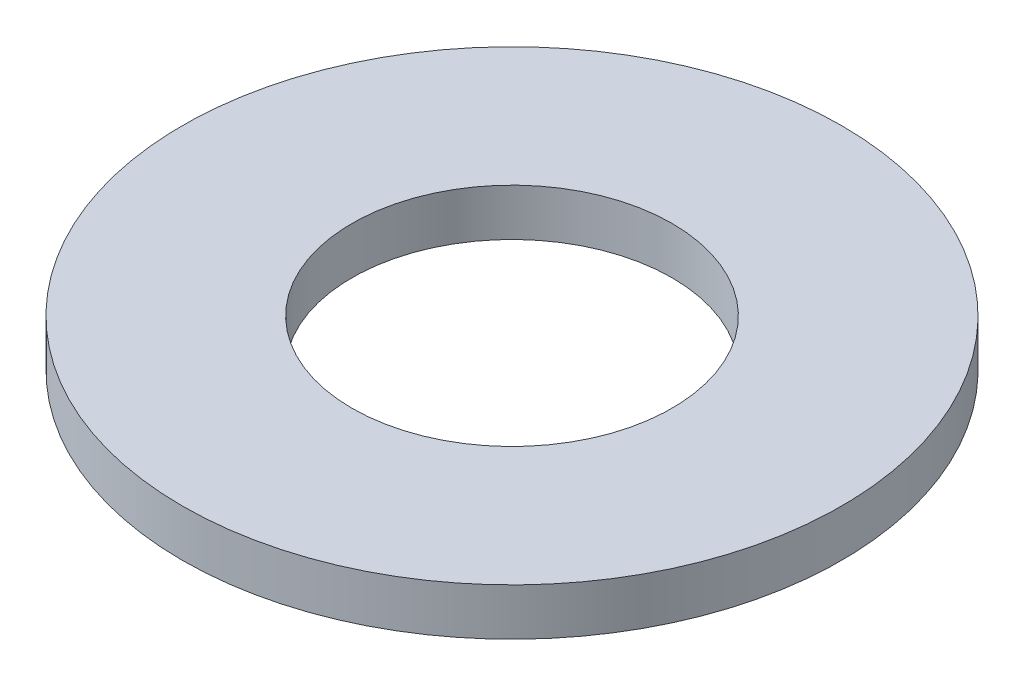
ISO-10303-21;
HEADER;
FILE_DESCRIPTION(('STEP AP214'),'2;1');
FILE_NAME('part.step','',(''),(''),'','','');
FILE_SCHEMA(('AUTOMOTIVE_DESIGN { 1 0 10303 214 1 1 1 1 }'));
ENDSEC;
DATA;
#1=APPLICATION_CONTEXT('core data for automotive mechanical design processes');
#2=APPLICATION_PROTOCOL_DEFINITION('international standard','automotive_design',2000,#1);
#3=PRODUCT_CONTEXT('',#1,'mechanical');
#4=PRODUCT('Part','Part','',(#3));
#5=PRODUCT_RELATED_PRODUCT_CATEGORY('part','',(#4));
#6=PRODUCT_DEFINITION_FORMATION('','',#4);
#7=PRODUCT_DEFINITION_CONTEXT('part definition',#1,'design');
#8=PRODUCT_DEFINITION('design','',#6,#7);
#9=PRODUCT_DEFINITION_SHAPE('','',#8);
#10=(LENGTH_UNIT() NAMED_UNIT(*) SI_UNIT(.MILLI.,.METRE.));
#11=(NAMED_UNIT(*) PLANE_ANGLE_UNIT() SI_UNIT($,.RADIAN.));
#12=(NAMED_UNIT(*) SI_UNIT($,.STERADIAN.) SOLID_ANGLE_UNIT());
#13=UNCERTAINTY_MEASURE_WITH_UNIT(LENGTH_MEASURE(1.E-05),#10,'distance_accuracy_value','');
#14=(GEOMETRIC_REPRESENTATION_CONTEXT(3) GLOBAL_UNCERTAINTY_ASSIGNED_CONTEXT((#13)) GLOBAL_UNIT_ASSIGNED_CONTEXT((#10,
#11,#12)) REPRESENTATION_CONTEXT('',''));
#15=CARTESIAN_POINT('',(0.,0.,0.));
#16=DIRECTION('',(0.,0.,1.));
#17=DIRECTION('',(1.,0.,0.));
#18=AXIS2_PLACEMENT_3D('',#15,#16,#17);
#19=CARTESIAN_POINT('',(0.,0.,0.));
#20=DIRECTION('',(0.,-1.,0.));
#21=DIRECTION('',(0.,0.,-1.));
#22=AXIS2_PLACEMENT_3D('',#19,#20,#21);
#23=CYLINDRICAL_SURFACE('',#22,1.7);
#24=CARTESIAN_POINT('',(0.,9.14450704225353,0.));
#25=DIRECTION('',(0.,-1.,0.));
#26=DIRECTION('',(0.,0.,-1.));
#27=AXIS2_PLACEMENT_3D('',#24,#25,#26);
#28=CIRCLE('',#27,1.7);
#29=CARTESIAN_POINT('',(0.,9.14450704225353,-1.7));
#30=VERTEX_POINT('',#29);
#31=EDGE_CURVE('E10',#30,#30,#28,.T.);
#32=ORIENTED_EDGE('',*,*,#31,.F.);
#33=EDGE_LOOP('',(#32));
#34=FACE_BOUND('',#33,.T.);
#35=CARTESIAN_POINT('',(0.,8.64450704225353,0.));
#36=DIRECTION('',(0.,-1.,0.));
#37=DIRECTION('',(0.,0.,-1.));
#38=AXIS2_PLACEMENT_3D('',#35,#36,#37);
#39=CIRCLE('',#38,1.7);
#40=CARTESIAN_POINT('',(0.,8.64450704225353,-1.7));
#41=VERTEX_POINT('',#40);
#42=EDGE_CURVE('E52',#41,#41,#39,.T.);
#43=ORIENTED_EDGE('',*,*,#42,.T.);
#44=EDGE_LOOP('',(#43));
#45=FACE_BOUND('',#44,.T.);
#46=ADVANCED_FACE('F34',(#34,#45),#23,.F.);
#47=CARTESIAN_POINT('',(-1.7,9.14450704225353,0.));
#48=DIRECTION('',(0.,-1.,0.));
#49=DIRECTION('',(0.,0.,-1.));
#50=AXIS2_PLACEMENT_3D('',#47,#48,#49);
#51=PLANE('',#50);
#52=CARTESIAN_POINT('',(0.,9.14450704225353,0.));
#53=DIRECTION('',(0.,-1.,0.));
#54=DIRECTION('',(0.,0.,-1.));
#55=AXIS2_PLACEMENT_3D('',#52,#53,#54);
#56=CIRCLE('',#55,3.5);
#57=CARTESIAN_POINT('',(0.,9.14450704225353,-3.5));
#58=VERTEX_POINT('',#57);
#59=EDGE_CURVE('E40',#58,#58,#56,.T.);
#60=ORIENTED_EDGE('',*,*,#59,.F.);
#61=EDGE_LOOP('',(#60));
#62=FACE_BOUND('',#61,.T.);
#63=ORIENTED_EDGE('',*,*,#31,.T.);
#64=EDGE_LOOP('',(#63));
#65=FACE_BOUND('',#64,.T.);
#66=ADVANCED_FACE('F69',(#62,#65),#51,.F.);
#67=CARTESIAN_POINT('',(0.,0.,0.));
#68=DIRECTION('',(0.,-1.,0.));
#69=DIRECTION('',(0.,0.,-1.));
#70=AXIS2_PLACEMENT_3D('',#67,#68,#69);
#71=CYLINDRICAL_SURFACE('',#70,3.5);
#72=CARTESIAN_POINT('',(0.,8.64450704225353,0.));
#73=DIRECTION('',(0.,-1.,0.));
#74=DIRECTION('',(0.,0.,-1.));
#75=AXIS2_PLACEMENT_3D('',#72,#73,#74);
#76=CIRCLE('',#75,3.5);
#77=CARTESIAN_POINT('',(0.,8.64450704225353,-3.5));
#78=VERTEX_POINT('',#77);
#79=EDGE_CURVE('E45',#78,#78,#76,.T.);
#80=ORIENTED_EDGE('',*,*,#79,.F.);
#81=EDGE_LOOP('',(#80));
#82=FACE_BOUND('',#81,.T.);
#83=ORIENTED_EDGE('',*,*,#59,.T.);
#84=EDGE_LOOP('',(#83));
#85=FACE_BOUND('',#84,.T.);
#86=ADVANCED_FACE('F64',(#82,#85),#71,.T.);
#87=CARTESIAN_POINT('',(-1.7,8.64450704225353,0.));
#88=DIRECTION('',(0.,1.,0.));
#89=DIRECTION('',(0.,0.,1.));
#90=AXIS2_PLACEMENT_3D('',#87,#88,#89);
#91=PLANE('',#90);
#92=ORIENTED_EDGE('',*,*,#42,.F.);
#93=EDGE_LOOP('',(#92));
#94=FACE_BOUND('',#93,.T.);
#95=ORIENTED_EDGE('',*,*,#79,.T.);
#96=EDGE_LOOP('',(#95));
#97=FACE_BOUND('',#96,.T.);
#98=ADVANCED_FACE('F61',(#94,#97),#91,.F.);
#99=CLOSED_SHELL('',(#46,#66,#86,#98));
#100=MANIFOLD_SOLID_BREP('B2',#99);
#101=ADVANCED_BREP_SHAPE_REPRESENTATION('',(#18,#100),#14);
#102=SHAPE_DEFINITION_REPRESENTATION(#9,#101);
ENDSEC;
END-ISO-10303-21;
